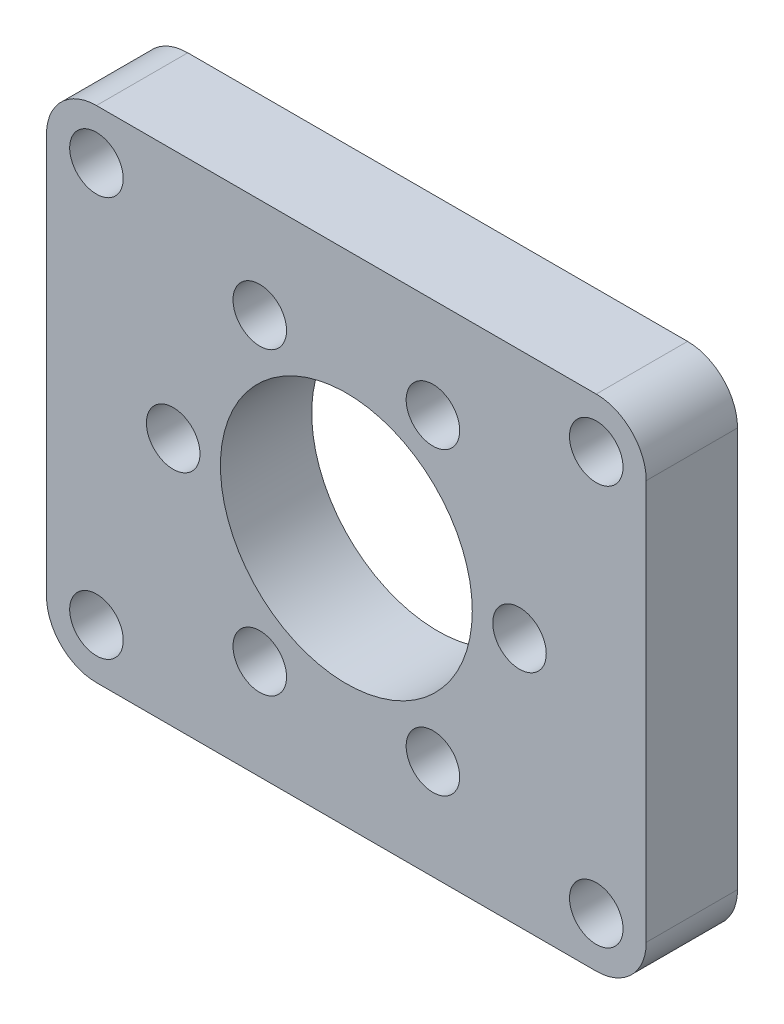
ISO-10303-21;
HEADER;
FILE_DESCRIPTION(('STEP AP214'),'2;1');
FILE_NAME('part.step','',(''),(''),'','','');
FILE_SCHEMA(('AUTOMOTIVE_DESIGN { 1 0 10303 214 1 1 1 1 }'));
ENDSEC;
DATA;
#1=APPLICATION_CONTEXT('core data for automotive mechanical design processes');
#2=APPLICATION_PROTOCOL_DEFINITION('international standard','automotive_design',2000,#1);
#3=PRODUCT_CONTEXT('',#1,'mechanical');
#4=PRODUCT('Part','Part','',(#3));
#5=PRODUCT_RELATED_PRODUCT_CATEGORY('part','',(#4));
#6=PRODUCT_DEFINITION_FORMATION('','',#4);
#7=PRODUCT_DEFINITION_CONTEXT('part definition',#1,'design');
#8=PRODUCT_DEFINITION('design','',#6,#7);
#9=PRODUCT_DEFINITION_SHAPE('','',#8);
#10=(LENGTH_UNIT() NAMED_UNIT(*) SI_UNIT(.MILLI.,.METRE.));
#11=(NAMED_UNIT(*) PLANE_ANGLE_UNIT() SI_UNIT($,.RADIAN.));
#12=(NAMED_UNIT(*) SI_UNIT($,.STERADIAN.) SOLID_ANGLE_UNIT());
#13=UNCERTAINTY_MEASURE_WITH_UNIT(LENGTH_MEASURE(1.E-05),#10,'distance_accuracy_value','');
#14=(GEOMETRIC_REPRESENTATION_CONTEXT(3) GLOBAL_UNCERTAINTY_ASSIGNED_CONTEXT((#13)) GLOBAL_UNIT_ASSIGNED_CONTEXT((#10,
#11,#12)) REPRESENTATION_CONTEXT('',''));
#15=CARTESIAN_POINT('',(0.,0.,0.));
#16=DIRECTION('',(0.,0.,1.));
#17=DIRECTION('',(1.,0.,0.));
#18=AXIS2_PLACEMENT_3D('',#15,#16,#17);
#19=CARTESIAN_POINT('',(0.,0.,5.8));
#20=DIRECTION('',(1.,0.,0.));
#21=DIRECTION('',(0.,0.,-1.));
#22=AXIS2_PLACEMENT_3D('',#19,#20,#21);
#23=PLANE('',#22);
#24=DIRECTION('',(0.,-1.,0.));
#25=VECTOR('',#24,1.);
#26=CARTESIAN_POINT('',(0.,0.,0.));
#27=LINE('',#26,#25);
#28=CARTESIAN_POINT('',(0.,28.575,0.));
#29=VERTEX_POINT('',#28);
#30=CARTESIAN_POINT('',(0.,3.175,0.));
#31=VERTEX_POINT('',#30);
#32=EDGE_CURVE('E128',#29,#31,#27,.T.);
#33=ORIENTED_EDGE('',*,*,#32,.T.);
#34=DIRECTION('',(0.,0.,-1.));
#35=VECTOR('',#34,1.);
#36=CARTESIAN_POINT('',(0.,3.175,5.8));
#37=LINE('',#36,#35);
#38=CARTESIAN_POINT('',(0.,3.175,5.8));
#39=VERTEX_POINT('',#38);
#40=EDGE_CURVE('E106',#31,#39,#37,.F.);
#41=ORIENTED_EDGE('',*,*,#40,.T.);
#42=DIRECTION('',(0.,-1.,0.));
#43=VECTOR('',#42,1.);
#44=CARTESIAN_POINT('',(0.,0.,5.8));
#45=LINE('',#44,#43);
#46=CARTESIAN_POINT('',(0.,28.575,5.8));
#47=VERTEX_POINT('',#46);
#48=EDGE_CURVE('E138',#47,#39,#45,.T.);
#49=ORIENTED_EDGE('',*,*,#48,.F.);
#50=DIRECTION('',(0.,0.,-1.));
#51=VECTOR('',#50,1.);
#52=CARTESIAN_POINT('',(0.,28.575,5.8));
#53=LINE('',#52,#51);
#54=EDGE_CURVE('E111',#47,#29,#53,.T.);
#55=ORIENTED_EDGE('',*,*,#54,.T.);
#56=EDGE_LOOP('',(#33,#41,#49,#55));
#57=FACE_BOUND('',#56,.T.);
#58=ADVANCED_FACE('F35',(#57),#23,.F.);
#59=CARTESIAN_POINT('',(0.,0.,5.8));
#60=DIRECTION('',(0.,1.,0.));
#61=DIRECTION('',(0.,0.,1.));
#62=AXIS2_PLACEMENT_3D('',#59,#60,#61);
#63=PLANE('',#62);
#64=DIRECTION('',(1.,0.,0.));
#65=VECTOR('',#64,1.);
#66=CARTESIAN_POINT('',(0.,0.,5.8));
#67=LINE('',#66,#65);
#68=CARTESIAN_POINT('',(3.175,0.,5.8));
#69=VERTEX_POINT('',#68);
#70=CARTESIAN_POINT('',(34.925,0.,5.8));
#71=VERTEX_POINT('',#70);
#72=EDGE_CURVE('E121',#69,#71,#67,.T.);
#73=ORIENTED_EDGE('',*,*,#72,.F.);
#74=DIRECTION('',(0.,0.,-1.));
#75=VECTOR('',#74,1.);
#76=CARTESIAN_POINT('',(3.175,0.,5.8));
#77=LINE('',#76,#75);
#78=CARTESIAN_POINT('',(3.175,0.,0.));
#79=VERTEX_POINT('',#78);
#80=EDGE_CURVE('E105',#69,#79,#77,.T.);
#81=ORIENTED_EDGE('',*,*,#80,.T.);
#82=DIRECTION('',(1.,0.,0.));
#83=VECTOR('',#82,1.);
#84=CARTESIAN_POINT('',(0.,0.,0.));
#85=LINE('',#84,#83);
#86=CARTESIAN_POINT('',(34.925,0.,0.));
#87=VERTEX_POINT('',#86);
#88=EDGE_CURVE('E118',#79,#87,#85,.T.);
#89=ORIENTED_EDGE('',*,*,#88,.T.);
#90=DIRECTION('',(0.,0.,-1.));
#91=VECTOR('',#90,1.);
#92=CARTESIAN_POINT('',(34.925,0.,5.8));
#93=LINE('',#92,#91);
#94=EDGE_CURVE('E123',#87,#71,#93,.F.);
#95=ORIENTED_EDGE('',*,*,#94,.T.);
#96=EDGE_LOOP('',(#73,#81,#89,#95));
#97=FACE_BOUND('',#96,.T.);
#98=ADVANCED_FACE('F117',(#97),#63,.F.);
#99=CARTESIAN_POINT('',(38.1,0.,5.8));
#100=DIRECTION('',(-1.,0.,0.));
#101=DIRECTION('',(0.,0.,1.));
#102=AXIS2_PLACEMENT_3D('',#99,#100,#101);
#103=PLANE('',#102);
#104=DIRECTION('',(0.,1.,0.));
#105=VECTOR('',#104,1.);
#106=CARTESIAN_POINT('',(38.1,0.,0.));
#107=LINE('',#106,#105);
#108=CARTESIAN_POINT('',(38.1,3.175,0.));
#109=VERTEX_POINT('',#108);
#110=CARTESIAN_POINT('',(38.1,28.575,0.));
#111=VERTEX_POINT('',#110);
#112=EDGE_CURVE('E127',#109,#111,#107,.T.);
#113=ORIENTED_EDGE('',*,*,#112,.T.);
#114=DIRECTION('',(0.,0.,-1.));
#115=VECTOR('',#114,1.);
#116=CARTESIAN_POINT('',(38.1,28.575,5.8));
#117=LINE('',#116,#115);
#118=CARTESIAN_POINT('',(38.1,28.575,5.8));
#119=VERTEX_POINT('',#118);
#120=EDGE_CURVE('E11',#111,#119,#117,.F.);
#121=ORIENTED_EDGE('',*,*,#120,.T.);
#122=DIRECTION('',(0.,1.,0.));
#123=VECTOR('',#122,1.);
#124=CARTESIAN_POINT('',(38.1,0.,5.8));
#125=LINE('',#124,#123);
#126=CARTESIAN_POINT('',(38.1,3.175,5.8));
#127=VERTEX_POINT('',#126);
#128=EDGE_CURVE('E169',#127,#119,#125,.T.);
#129=ORIENTED_EDGE('',*,*,#128,.F.);
#130=DIRECTION('',(0.,0.,-1.));
#131=VECTOR('',#130,1.);
#132=CARTESIAN_POINT('',(38.1,3.175,5.8));
#133=LINE('',#132,#131);
#134=EDGE_CURVE('E43',#127,#109,#133,.T.);
#135=ORIENTED_EDGE('',*,*,#134,.T.);
#136=EDGE_LOOP('',(#113,#121,#129,#135));
#137=FACE_BOUND('',#136,.T.);
#138=ADVANCED_FACE('F167',(#137),#103,.F.);
#139=CARTESIAN_POINT('',(0.,31.75,5.8));
#140=DIRECTION('',(0.,-1.,0.));
#141=DIRECTION('',(0.,0.,-1.));
#142=AXIS2_PLACEMENT_3D('',#139,#140,#141);
#143=PLANE('',#142);
#144=DIRECTION('',(-1.,0.,0.));
#145=VECTOR('',#144,1.);
#146=CARTESIAN_POINT('',(0.,31.75,0.));
#147=LINE('',#146,#145);
#148=CARTESIAN_POINT('',(34.925,31.75,0.));
#149=VERTEX_POINT('',#148);
#150=CARTESIAN_POINT('',(3.175,31.75,0.));
#151=VERTEX_POINT('',#150);
#152=EDGE_CURVE('E131',#149,#151,#147,.T.);
#153=ORIENTED_EDGE('',*,*,#152,.T.);
#154=DIRECTION('',(0.,0.,-1.));
#155=VECTOR('',#154,1.);
#156=CARTESIAN_POINT('',(3.175,31.75,5.8));
#157=LINE('',#156,#155);
#158=CARTESIAN_POINT('',(3.175,31.75,5.8));
#159=VERTEX_POINT('',#158);
#160=EDGE_CURVE('E50',#151,#159,#157,.F.);
#161=ORIENTED_EDGE('',*,*,#160,.T.);
#162=DIRECTION('',(-1.,0.,0.));
#163=VECTOR('',#162,1.);
#164=CARTESIAN_POINT('',(0.,31.75,5.8));
#165=LINE('',#164,#163);
#166=CARTESIAN_POINT('',(34.925,31.75,5.8));
#167=VERTEX_POINT('',#166);
#168=EDGE_CURVE('E144',#167,#159,#165,.T.);
#169=ORIENTED_EDGE('',*,*,#168,.F.);
#170=DIRECTION('',(0.,0.,-1.));
#171=VECTOR('',#170,1.);
#172=CARTESIAN_POINT('',(34.925,31.75,5.8));
#173=LINE('',#172,#171);
#174=EDGE_CURVE('E160',#167,#149,#173,.T.);
#175=ORIENTED_EDGE('',*,*,#174,.T.);
#176=EDGE_LOOP('',(#153,#161,#169,#175));
#177=FACE_BOUND('',#176,.T.);
#178=ADVANCED_FACE('F176',(#177),#143,.F.);
#179=CARTESIAN_POINT('',(0.,31.75,5.8));
#180=DIRECTION('',(0.,0.,-1.));
#181=DIRECTION('',(-1.,0.,0.));
#182=AXIS2_PLACEMENT_3D('',#179,#180,#181);
#183=PLANE('',#182);
#184=CARTESIAN_POINT('',(3.175,28.575,5.8));
#185=DIRECTION('',(0.,0.,1.));
#186=DIRECTION('',(1.,0.,0.));
#187=AXIS2_PLACEMENT_3D('',#184,#185,#186);
#188=CIRCLE('',#187,1.69999999999999);
#189=CARTESIAN_POINT('',(4.87499999999999,28.575,5.8));
#190=VERTEX_POINT('',#189);
#191=EDGE_CURVE('E240',#190,#190,#188,.T.);
#192=ORIENTED_EDGE('',*,*,#191,.F.);
#193=EDGE_LOOP('',(#192));
#194=FACE_BOUND('',#193,.T.);
#195=CARTESIAN_POINT('',(34.925,28.575,5.8));
#196=DIRECTION('',(0.,0.,1.));
#197=DIRECTION('',(1.,0.,0.));
#198=AXIS2_PLACEMENT_3D('',#195,#196,#197);
#199=CIRCLE('',#198,1.69999999999999);
#200=CARTESIAN_POINT('',(36.625,28.575,5.8));
#201=VERTEX_POINT('',#200);
#202=EDGE_CURVE('E234',#201,#201,#199,.T.);
#203=ORIENTED_EDGE('',*,*,#202,.F.);
#204=EDGE_LOOP('',(#203));
#205=FACE_BOUND('',#204,.T.);
#206=CARTESIAN_POINT('',(34.925,3.175,5.8));
#207=DIRECTION('',(0.,0.,1.));
#208=DIRECTION('',(1.,0.,0.));
#209=AXIS2_PLACEMENT_3D('',#206,#207,#208);
#210=CIRCLE('',#209,1.69999999999999);
#211=CARTESIAN_POINT('',(36.625,3.175,5.8));
#212=VERTEX_POINT('',#211);
#213=EDGE_CURVE('E228',#212,#212,#210,.T.);
#214=ORIENTED_EDGE('',*,*,#213,.F.);
#215=EDGE_LOOP('',(#214));
#216=FACE_BOUND('',#215,.T.);
#217=CARTESIAN_POINT('',(3.175,3.17500000000001,5.8));
#218=DIRECTION('',(0.,0.,1.));
#219=DIRECTION('',(1.,0.,0.));
#220=AXIS2_PLACEMENT_3D('',#217,#218,#219);
#221=CIRCLE('',#220,1.69999999999999);
#222=CARTESIAN_POINT('',(4.87499999999999,3.17500000000001,5.8));
#223=VERTEX_POINT('',#222);
#224=EDGE_CURVE('E222',#223,#223,#221,.T.);
#225=ORIENTED_EDGE('',*,*,#224,.F.);
#226=EDGE_LOOP('',(#225));
#227=FACE_BOUND('',#226,.T.);
#228=CARTESIAN_POINT('',(30.05,15.875,5.8));
#229=DIRECTION('',(0.,0.,1.));
#230=DIRECTION('',(1.,0.,0.));
#231=AXIS2_PLACEMENT_3D('',#228,#229,#230);
#232=CIRCLE('',#231,1.69999999999999);
#233=CARTESIAN_POINT('',(31.75,15.875,5.8));
#234=VERTEX_POINT('',#233);
#235=EDGE_CURVE('E216',#234,#234,#232,.T.);
#236=ORIENTED_EDGE('',*,*,#235,.F.);
#237=EDGE_LOOP('',(#236));
#238=FACE_BOUND('',#237,.T.);
#239=CARTESIAN_POINT('',(24.55,25.4012794416288,5.8));
#240=DIRECTION('',(0.,0.,1.));
#241=DIRECTION('',(1.,0.,0.));
#242=AXIS2_PLACEMENT_3D('',#239,#240,#241);
#243=CIRCLE('',#242,1.69999999999999);
#244=CARTESIAN_POINT('',(26.25,25.4012794416288,5.8));
#245=VERTEX_POINT('',#244);
#246=EDGE_CURVE('E210',#245,#245,#243,.T.);
#247=ORIENTED_EDGE('',*,*,#246,.F.);
#248=EDGE_LOOP('',(#247));
#249=FACE_BOUND('',#248,.T.);
#250=CARTESIAN_POINT('',(13.55,25.4012794416288,5.8));
#251=DIRECTION('',(0.,0.,1.));
#252=DIRECTION('',(1.,0.,0.));
#253=AXIS2_PLACEMENT_3D('',#250,#251,#252);
#254=CIRCLE('',#253,1.69999999999999);
#255=CARTESIAN_POINT('',(15.25,25.4012794416288,5.8));
#256=VERTEX_POINT('',#255);
#257=EDGE_CURVE('E143',#256,#256,#254,.T.);
#258=ORIENTED_EDGE('',*,*,#257,.F.);
#259=EDGE_LOOP('',(#258));
#260=FACE_BOUND('',#259,.T.);
#261=CARTESIAN_POINT('',(8.05,15.875,5.8));
#262=DIRECTION('',(0.,0.,1.));
#263=DIRECTION('',(1.,0.,0.));
#264=AXIS2_PLACEMENT_3D('',#261,#262,#263);
#265=CIRCLE('',#264,1.69999999999999);
#266=CARTESIAN_POINT('',(9.74999999999999,15.875,5.8));
#267=VERTEX_POINT('',#266);
#268=EDGE_CURVE('E142',#267,#267,#265,.T.);
#269=ORIENTED_EDGE('',*,*,#268,.F.);
#270=EDGE_LOOP('',(#269));
#271=FACE_BOUND('',#270,.T.);
#272=CARTESIAN_POINT('',(13.55,6.34872055837117,5.8));
#273=DIRECTION('',(0.,0.,1.));
#274=DIRECTION('',(1.,0.,0.));
#275=AXIS2_PLACEMENT_3D('',#272,#273,#274);
#276=CIRCLE('',#275,1.69999999999999);
#277=CARTESIAN_POINT('',(15.25,6.34872055837117,5.8));
#278=VERTEX_POINT('',#277);
#279=EDGE_CURVE('E197',#278,#278,#276,.T.);
#280=ORIENTED_EDGE('',*,*,#279,.F.);
#281=EDGE_LOOP('',(#280));
#282=FACE_BOUND('',#281,.T.);
#283=CARTESIAN_POINT('',(24.55,6.34872055837118,5.8));
#284=DIRECTION('',(0.,0.,1.));
#285=DIRECTION('',(1.,0.,0.));
#286=AXIS2_PLACEMENT_3D('',#283,#284,#285);
#287=CIRCLE('',#286,1.69999999999999);
#288=CARTESIAN_POINT('',(26.25,6.34872055837118,5.8));
#289=VERTEX_POINT('',#288);
#290=EDGE_CURVE('E191',#289,#289,#287,.T.);
#291=ORIENTED_EDGE('',*,*,#290,.F.);
#292=EDGE_LOOP('',(#291));
#293=FACE_BOUND('',#292,.T.);
#294=CARTESIAN_POINT('',(19.05,15.875,5.8));
#295=DIRECTION('',(0.,0.,1.));
#296=DIRECTION('',(1.,0.,0.));
#297=AXIS2_PLACEMENT_3D('',#294,#295,#296);
#298=CIRCLE('',#297,8.);
#299=CARTESIAN_POINT('',(27.05,15.875,5.8));
#300=VERTEX_POINT('',#299);
#301=EDGE_CURVE('E183',#300,#300,#298,.T.);
#302=ORIENTED_EDGE('',*,*,#301,.F.);
#303=EDGE_LOOP('',(#302));
#304=FACE_BOUND('',#303,.T.);
#305=ORIENTED_EDGE('',*,*,#48,.T.);
#306=CARTESIAN_POINT('',(3.175,3.175,5.8));
#307=DIRECTION('',(0.,0.,-1.));
#308=DIRECTION('',(-1.,0.,0.));
#309=AXIS2_PLACEMENT_3D('',#306,#307,#308);
#310=CIRCLE('',#309,3.175);
#311=EDGE_CURVE('E158',#39,#69,#310,.F.);
#312=ORIENTED_EDGE('',*,*,#311,.T.);
#313=ORIENTED_EDGE('',*,*,#72,.T.);
#314=CARTESIAN_POINT('',(34.925,3.175,5.8));
#315=DIRECTION('',(0.,0.,-1.));
#316=DIRECTION('',(-1.,0.,0.));
#317=AXIS2_PLACEMENT_3D('',#314,#315,#316);
#318=CIRCLE('',#317,3.175);
#319=EDGE_CURVE('E153',#71,#127,#318,.F.);
#320=ORIENTED_EDGE('',*,*,#319,.T.);
#321=ORIENTED_EDGE('',*,*,#128,.T.);
#322=CARTESIAN_POINT('',(34.925,28.575,5.8));
#323=DIRECTION('',(0.,0.,-1.));
#324=DIRECTION('',(-1.,0.,0.));
#325=AXIS2_PLACEMENT_3D('',#322,#323,#324);
#326=CIRCLE('',#325,3.175);
#327=EDGE_CURVE('E57',#119,#167,#326,.F.);
#328=ORIENTED_EDGE('',*,*,#327,.T.);
#329=ORIENTED_EDGE('',*,*,#168,.T.);
#330=CARTESIAN_POINT('',(3.175,28.575,5.8));
#331=DIRECTION('',(0.,0.,-1.));
#332=DIRECTION('',(-1.,0.,0.));
#333=AXIS2_PLACEMENT_3D('',#330,#331,#332);
#334=CIRCLE('',#333,3.175);
#335=EDGE_CURVE('E156',#159,#47,#334,.F.);
#336=ORIENTED_EDGE('',*,*,#335,.T.);
#337=EDGE_LOOP('',(#305,#312,#313,#320,#321,#328,#329,#336));
#338=FACE_BOUND('',#337,.T.);
#339=ADVANCED_FACE('F246',(#194,#205,#216,#227,#238,#249,#260,#271,#282,#293,#304,#338),#183,.F.);
#340=CARTESIAN_POINT('',(0.,31.75,0.));
#341=DIRECTION('',(0.,0.,-1.));
#342=DIRECTION('',(-1.,0.,0.));
#343=AXIS2_PLACEMENT_3D('',#340,#341,#342);
#344=PLANE('',#343);
#345=CARTESIAN_POINT('',(3.175,28.575,0.));
#346=DIRECTION('',(0.,0.,-1.));
#347=DIRECTION('',(-1.,0.,0.));
#348=AXIS2_PLACEMENT_3D('',#345,#346,#347);
#349=CIRCLE('',#348,1.69999999999999);
#350=CARTESIAN_POINT('',(1.47500000000001,28.575,0.));
#351=VERTEX_POINT('',#350);
#352=EDGE_CURVE('E237',#351,#351,#349,.T.);
#353=ORIENTED_EDGE('',*,*,#352,.F.);
#354=EDGE_LOOP('',(#353));
#355=FACE_BOUND('',#354,.T.);
#356=CARTESIAN_POINT('',(34.925,28.575,0.));
#357=DIRECTION('',(0.,0.,-1.));
#358=DIRECTION('',(-1.,0.,0.));
#359=AXIS2_PLACEMENT_3D('',#356,#357,#358);
#360=CIRCLE('',#359,1.69999999999999);
#361=CARTESIAN_POINT('',(33.225,28.575,0.));
#362=VERTEX_POINT('',#361);
#363=EDGE_CURVE('E231',#362,#362,#360,.T.);
#364=ORIENTED_EDGE('',*,*,#363,.F.);
#365=EDGE_LOOP('',(#364));
#366=FACE_BOUND('',#365,.T.);
#367=CARTESIAN_POINT('',(34.925,3.175,0.));
#368=DIRECTION('',(0.,0.,-1.));
#369=DIRECTION('',(-1.,0.,0.));
#370=AXIS2_PLACEMENT_3D('',#367,#368,#369);
#371=CIRCLE('',#370,1.69999999999999);
#372=CARTESIAN_POINT('',(33.225,3.175,0.));
#373=VERTEX_POINT('',#372);
#374=EDGE_CURVE('E225',#373,#373,#371,.T.);
#375=ORIENTED_EDGE('',*,*,#374,.F.);
#376=EDGE_LOOP('',(#375));
#377=FACE_BOUND('',#376,.T.);
#378=CARTESIAN_POINT('',(3.175,3.17500000000001,0.));
#379=DIRECTION('',(0.,0.,-1.));
#380=DIRECTION('',(-1.,0.,0.));
#381=AXIS2_PLACEMENT_3D('',#378,#379,#380);
#382=CIRCLE('',#381,1.69999999999999);
#383=CARTESIAN_POINT('',(1.47500000000001,3.17500000000001,0.));
#384=VERTEX_POINT('',#383);
#385=EDGE_CURVE('E219',#384,#384,#382,.T.);
#386=ORIENTED_EDGE('',*,*,#385,.F.);
#387=EDGE_LOOP('',(#386));
#388=FACE_BOUND('',#387,.T.);
#389=CARTESIAN_POINT('',(30.05,15.875,0.));
#390=DIRECTION('',(0.,0.,-1.));
#391=DIRECTION('',(-1.,0.,0.));
#392=AXIS2_PLACEMENT_3D('',#389,#390,#391);
#393=CIRCLE('',#392,1.69999999999999);
#394=CARTESIAN_POINT('',(28.35,15.875,0.));
#395=VERTEX_POINT('',#394);
#396=EDGE_CURVE('E213',#395,#395,#393,.T.);
#397=ORIENTED_EDGE('',*,*,#396,.F.);
#398=EDGE_LOOP('',(#397));
#399=FACE_BOUND('',#398,.T.);
#400=CARTESIAN_POINT('',(24.55,25.4012794416288,0.));
#401=DIRECTION('',(0.,0.,-1.));
#402=DIRECTION('',(-1.,0.,0.));
#403=AXIS2_PLACEMENT_3D('',#400,#401,#402);
#404=CIRCLE('',#403,1.69999999999999);
#405=CARTESIAN_POINT('',(22.85,25.4012794416288,0.));
#406=VERTEX_POINT('',#405);
#407=EDGE_CURVE('E207',#406,#406,#404,.T.);
#408=ORIENTED_EDGE('',*,*,#407,.F.);
#409=EDGE_LOOP('',(#408));
#410=FACE_BOUND('',#409,.T.);
#411=CARTESIAN_POINT('',(13.55,25.4012794416288,0.));
#412=DIRECTION('',(0.,0.,-1.));
#413=DIRECTION('',(-1.,0.,0.));
#414=AXIS2_PLACEMENT_3D('',#411,#412,#413);
#415=CIRCLE('',#414,1.69999999999999);
#416=CARTESIAN_POINT('',(11.85,25.4012794416288,0.));
#417=VERTEX_POINT('',#416);
#418=EDGE_CURVE('E139',#417,#417,#415,.T.);
#419=ORIENTED_EDGE('',*,*,#418,.F.);
#420=EDGE_LOOP('',(#419));
#421=FACE_BOUND('',#420,.T.);
#422=CARTESIAN_POINT('',(8.05,15.875,0.));
#423=DIRECTION('',(0.,0.,-1.));
#424=DIRECTION('',(-1.,0.,0.));
#425=AXIS2_PLACEMENT_3D('',#422,#423,#424);
#426=CIRCLE('',#425,1.69999999999999);
#427=CARTESIAN_POINT('',(6.35000000000001,15.875,0.));
#428=VERTEX_POINT('',#427);
#429=EDGE_CURVE('E200',#428,#428,#426,.T.);
#430=ORIENTED_EDGE('',*,*,#429,.F.);
#431=EDGE_LOOP('',(#430));
#432=FACE_BOUND('',#431,.T.);
#433=CARTESIAN_POINT('',(13.55,6.34872055837117,0.));
#434=DIRECTION('',(0.,0.,-1.));
#435=DIRECTION('',(-1.,0.,0.));
#436=AXIS2_PLACEMENT_3D('',#433,#434,#435);
#437=CIRCLE('',#436,1.69999999999999);
#438=CARTESIAN_POINT('',(11.85,6.34872055837117,0.));
#439=VERTEX_POINT('',#438);
#440=EDGE_CURVE('E194',#439,#439,#437,.T.);
#441=ORIENTED_EDGE('',*,*,#440,.F.);
#442=EDGE_LOOP('',(#441));
#443=FACE_BOUND('',#442,.T.);
#444=CARTESIAN_POINT('',(24.55,6.34872055837118,0.));
#445=DIRECTION('',(0.,0.,-1.));
#446=DIRECTION('',(-1.,0.,0.));
#447=AXIS2_PLACEMENT_3D('',#444,#445,#446);
#448=CIRCLE('',#447,1.69999999999999);
#449=CARTESIAN_POINT('',(22.85,6.34872055837118,0.));
#450=VERTEX_POINT('',#449);
#451=EDGE_CURVE('E186',#450,#450,#448,.T.);
#452=ORIENTED_EDGE('',*,*,#451,.F.);
#453=EDGE_LOOP('',(#452));
#454=FACE_BOUND('',#453,.T.);
#455=CARTESIAN_POINT('',(19.05,15.875,0.));
#456=DIRECTION('',(0.,0.,1.));
#457=DIRECTION('',(1.,0.,0.));
#458=AXIS2_PLACEMENT_3D('',#455,#456,#457);
#459=CIRCLE('',#458,8.);
#460=CARTESIAN_POINT('',(27.05,15.875,0.));
#461=VERTEX_POINT('',#460);
#462=EDGE_CURVE('E133',#461,#461,#459,.T.);
#463=ORIENTED_EDGE('',*,*,#462,.T.);
#464=EDGE_LOOP('',(#463));
#465=FACE_BOUND('',#464,.T.);
#466=ORIENTED_EDGE('',*,*,#88,.F.);
#467=CARTESIAN_POINT('',(3.175,3.175,0.));
#468=DIRECTION('',(0.,0.,-1.));
#469=DIRECTION('',(-1.,0.,0.));
#470=AXIS2_PLACEMENT_3D('',#467,#468,#469);
#471=CIRCLE('',#470,3.175);
#472=EDGE_CURVE('E101',#79,#31,#471,.T.);
#473=ORIENTED_EDGE('',*,*,#472,.T.);
#474=ORIENTED_EDGE('',*,*,#32,.F.);
#475=CARTESIAN_POINT('',(3.175,28.575,0.));
#476=DIRECTION('',(0.,0.,-1.));
#477=DIRECTION('',(-1.,0.,0.));
#478=AXIS2_PLACEMENT_3D('',#475,#476,#477);
#479=CIRCLE('',#478,3.175);
#480=EDGE_CURVE('E112',#29,#151,#479,.T.);
#481=ORIENTED_EDGE('',*,*,#480,.T.);
#482=ORIENTED_EDGE('',*,*,#152,.F.);
#483=CARTESIAN_POINT('',(34.925,28.575,0.));
#484=DIRECTION('',(0.,0.,-1.));
#485=DIRECTION('',(-1.,0.,0.));
#486=AXIS2_PLACEMENT_3D('',#483,#484,#485);
#487=CIRCLE('',#486,3.175);
#488=EDGE_CURVE('E147',#149,#111,#487,.T.);
#489=ORIENTED_EDGE('',*,*,#488,.T.);
#490=ORIENTED_EDGE('',*,*,#112,.F.);
#491=CARTESIAN_POINT('',(34.925,3.175,0.));
#492=DIRECTION('',(0.,0.,-1.));
#493=DIRECTION('',(-1.,0.,0.));
#494=AXIS2_PLACEMENT_3D('',#491,#492,#493);
#495=CIRCLE('',#494,3.175);
#496=EDGE_CURVE('E122',#109,#87,#495,.T.);
#497=ORIENTED_EDGE('',*,*,#496,.T.);
#498=EDGE_LOOP('',(#466,#473,#474,#481,#482,#489,#490,#497));
#499=FACE_BOUND('',#498,.T.);
#500=ADVANCED_FACE('F125',(#355,#366,#377,#388,#399,#410,#421,#432,#443,#454,#465,#499),#344,.T.);
#501=CARTESIAN_POINT('',(19.05,15.875,0.));
#502=DIRECTION('',(0.,0.,1.));
#503=DIRECTION('',(1.,0.,0.));
#504=AXIS2_PLACEMENT_3D('',#501,#502,#503);
#505=CYLINDRICAL_SURFACE('',#504,8.);
#506=ORIENTED_EDGE('',*,*,#462,.F.);
#507=EDGE_LOOP('',(#506));
#508=FACE_BOUND('',#507,.T.);
#509=ORIENTED_EDGE('',*,*,#301,.T.);
#510=EDGE_LOOP('',(#509));
#511=FACE_BOUND('',#510,.T.);
#512=ADVANCED_FACE('F293',(#508,#511),#505,.F.);
#513=CARTESIAN_POINT('',(24.55,6.34872055837118,5.8));
#514=DIRECTION('',(0.,0.,1.));
#515=DIRECTION('',(1.,0.,0.));
#516=AXIS2_PLACEMENT_3D('',#513,#514,#515);
#517=CYLINDRICAL_SURFACE('',#516,1.69999999999999);
#518=ORIENTED_EDGE('',*,*,#451,.T.);
#519=EDGE_LOOP('',(#518));
#520=FACE_BOUND('',#519,.T.);
#521=ORIENTED_EDGE('',*,*,#290,.T.);
#522=EDGE_LOOP('',(#521));
#523=FACE_BOUND('',#522,.T.);
#524=ADVANCED_FACE('F298',(#520,#523),#517,.F.);
#525=CARTESIAN_POINT('',(13.55,6.34872055837117,5.8));
#526=DIRECTION('',(0.,0.,1.));
#527=DIRECTION('',(1.,0.,0.));
#528=AXIS2_PLACEMENT_3D('',#525,#526,#527);
#529=CYLINDRICAL_SURFACE('',#528,1.69999999999999);
#530=ORIENTED_EDGE('',*,*,#440,.T.);
#531=EDGE_LOOP('',(#530));
#532=FACE_BOUND('',#531,.T.);
#533=ORIENTED_EDGE('',*,*,#279,.T.);
#534=EDGE_LOOP('',(#533));
#535=FACE_BOUND('',#534,.T.);
#536=ADVANCED_FACE('F302',(#532,#535),#529,.F.);
#537=CARTESIAN_POINT('',(8.05,15.875,5.8));
#538=DIRECTION('',(0.,0.,1.));
#539=DIRECTION('',(1.,0.,0.));
#540=AXIS2_PLACEMENT_3D('',#537,#538,#539);
#541=CYLINDRICAL_SURFACE('',#540,1.69999999999999);
#542=ORIENTED_EDGE('',*,*,#429,.T.);
#543=EDGE_LOOP('',(#542));
#544=FACE_BOUND('',#543,.T.);
#545=ORIENTED_EDGE('',*,*,#268,.T.);
#546=EDGE_LOOP('',(#545));
#547=FACE_BOUND('',#546,.T.);
#548=ADVANCED_FACE('F306',(#544,#547),#541,.F.);
#549=CARTESIAN_POINT('',(13.55,25.4012794416288,5.8));
#550=DIRECTION('',(0.,0.,1.));
#551=DIRECTION('',(1.,0.,0.));
#552=AXIS2_PLACEMENT_3D('',#549,#550,#551);
#553=CYLINDRICAL_SURFACE('',#552,1.69999999999999);
#554=ORIENTED_EDGE('',*,*,#418,.T.);
#555=EDGE_LOOP('',(#554));
#556=FACE_BOUND('',#555,.T.);
#557=ORIENTED_EDGE('',*,*,#257,.T.);
#558=EDGE_LOOP('',(#557));
#559=FACE_BOUND('',#558,.T.);
#560=ADVANCED_FACE('F310',(#556,#559),#553,.F.);
#561=CARTESIAN_POINT('',(24.55,25.4012794416288,5.8));
#562=DIRECTION('',(0.,0.,1.));
#563=DIRECTION('',(1.,0.,0.));
#564=AXIS2_PLACEMENT_3D('',#561,#562,#563);
#565=CYLINDRICAL_SURFACE('',#564,1.69999999999999);
#566=ORIENTED_EDGE('',*,*,#407,.T.);
#567=EDGE_LOOP('',(#566));
#568=FACE_BOUND('',#567,.T.);
#569=ORIENTED_EDGE('',*,*,#246,.T.);
#570=EDGE_LOOP('',(#569));
#571=FACE_BOUND('',#570,.T.);
#572=ADVANCED_FACE('F314',(#568,#571),#565,.F.);
#573=CARTESIAN_POINT('',(30.05,15.875,5.8));
#574=DIRECTION('',(0.,0.,1.));
#575=DIRECTION('',(1.,0.,0.));
#576=AXIS2_PLACEMENT_3D('',#573,#574,#575);
#577=CYLINDRICAL_SURFACE('',#576,1.69999999999999);
#578=ORIENTED_EDGE('',*,*,#396,.T.);
#579=EDGE_LOOP('',(#578));
#580=FACE_BOUND('',#579,.T.);
#581=ORIENTED_EDGE('',*,*,#235,.T.);
#582=EDGE_LOOP('',(#581));
#583=FACE_BOUND('',#582,.T.);
#584=ADVANCED_FACE('F318',(#580,#583),#577,.F.);
#585=CARTESIAN_POINT('',(3.175,3.17500000000001,5.8));
#586=DIRECTION('',(0.,0.,1.));
#587=DIRECTION('',(1.,0.,0.));
#588=AXIS2_PLACEMENT_3D('',#585,#586,#587);
#589=CYLINDRICAL_SURFACE('',#588,1.69999999999999);
#590=ORIENTED_EDGE('',*,*,#385,.T.);
#591=EDGE_LOOP('',(#590));
#592=FACE_BOUND('',#591,.T.);
#593=ORIENTED_EDGE('',*,*,#224,.T.);
#594=EDGE_LOOP('',(#593));
#595=FACE_BOUND('',#594,.T.);
#596=ADVANCED_FACE('F322',(#592,#595),#589,.F.);
#597=CARTESIAN_POINT('',(34.925,3.175,5.8));
#598=DIRECTION('',(0.,0.,1.));
#599=DIRECTION('',(1.,0.,0.));
#600=AXIS2_PLACEMENT_3D('',#597,#598,#599);
#601=CYLINDRICAL_SURFACE('',#600,1.69999999999999);
#602=ORIENTED_EDGE('',*,*,#374,.T.);
#603=EDGE_LOOP('',(#602));
#604=FACE_BOUND('',#603,.T.);
#605=ORIENTED_EDGE('',*,*,#213,.T.);
#606=EDGE_LOOP('',(#605));
#607=FACE_BOUND('',#606,.T.);
#608=ADVANCED_FACE('F326',(#604,#607),#601,.F.);
#609=CARTESIAN_POINT('',(34.925,28.575,5.8));
#610=DIRECTION('',(0.,0.,1.));
#611=DIRECTION('',(1.,0.,0.));
#612=AXIS2_PLACEMENT_3D('',#609,#610,#611);
#613=CYLINDRICAL_SURFACE('',#612,1.69999999999999);
#614=ORIENTED_EDGE('',*,*,#363,.T.);
#615=EDGE_LOOP('',(#614));
#616=FACE_BOUND('',#615,.T.);
#617=ORIENTED_EDGE('',*,*,#202,.T.);
#618=EDGE_LOOP('',(#617));
#619=FACE_BOUND('',#618,.T.);
#620=ADVANCED_FACE('F330',(#616,#619),#613,.F.);
#621=CARTESIAN_POINT('',(3.175,28.575,5.8));
#622=DIRECTION('',(0.,0.,1.));
#623=DIRECTION('',(1.,0.,0.));
#624=AXIS2_PLACEMENT_3D('',#621,#622,#623);
#625=CYLINDRICAL_SURFACE('',#624,1.69999999999999);
#626=ORIENTED_EDGE('',*,*,#352,.T.);
#627=EDGE_LOOP('',(#626));
#628=FACE_BOUND('',#627,.T.);
#629=ORIENTED_EDGE('',*,*,#191,.T.);
#630=EDGE_LOOP('',(#629));
#631=FACE_BOUND('',#630,.T.);
#632=ADVANCED_FACE('F244',(#628,#631),#625,.F.);
#633=CARTESIAN_POINT('',(3.175,3.175,5.8));
#634=DIRECTION('',(0.,0.,-1.));
#635=DIRECTION('',(-1.,0.,0.));
#636=AXIS2_PLACEMENT_3D('',#633,#634,#635);
#637=CYLINDRICAL_SURFACE('',#636,3.175);
#638=ORIENTED_EDGE('',*,*,#311,.F.);
#639=ORIENTED_EDGE('',*,*,#40,.F.);
#640=ORIENTED_EDGE('',*,*,#472,.F.);
#641=ORIENTED_EDGE('',*,*,#80,.F.);
#642=EDGE_LOOP('',(#638,#639,#640,#641));
#643=FACE_BOUND('',#642,.T.);
#644=ADVANCED_FACE('F104',(#643),#637,.T.);
#645=CARTESIAN_POINT('',(3.175,28.575,5.8));
#646=DIRECTION('',(0.,0.,-1.));
#647=DIRECTION('',(-1.,0.,0.));
#648=AXIS2_PLACEMENT_3D('',#645,#646,#647);
#649=CYLINDRICAL_SURFACE('',#648,3.175);
#650=ORIENTED_EDGE('',*,*,#335,.F.);
#651=ORIENTED_EDGE('',*,*,#160,.F.);
#652=ORIENTED_EDGE('',*,*,#480,.F.);
#653=ORIENTED_EDGE('',*,*,#54,.F.);
#654=EDGE_LOOP('',(#650,#651,#652,#653));
#655=FACE_BOUND('',#654,.T.);
#656=ADVANCED_FACE('F273',(#655),#649,.T.);
#657=CARTESIAN_POINT('',(34.925,28.575,5.8));
#658=DIRECTION('',(0.,0.,-1.));
#659=DIRECTION('',(-1.,0.,0.));
#660=AXIS2_PLACEMENT_3D('',#657,#658,#659);
#661=CYLINDRICAL_SURFACE('',#660,3.175);
#662=ORIENTED_EDGE('',*,*,#327,.F.);
#663=ORIENTED_EDGE('',*,*,#120,.F.);
#664=ORIENTED_EDGE('',*,*,#488,.F.);
#665=ORIENTED_EDGE('',*,*,#174,.F.);
#666=EDGE_LOOP('',(#662,#663,#664,#665));
#667=FACE_BOUND('',#666,.T.);
#668=ADVANCED_FACE('F175',(#667),#661,.T.);
#669=CARTESIAN_POINT('',(34.925,3.175,5.8));
#670=DIRECTION('',(0.,0.,-1.));
#671=DIRECTION('',(-1.,0.,0.));
#672=AXIS2_PLACEMENT_3D('',#669,#670,#671);
#673=CYLINDRICAL_SURFACE('',#672,3.175);
#674=ORIENTED_EDGE('',*,*,#319,.F.);
#675=ORIENTED_EDGE('',*,*,#94,.F.);
#676=ORIENTED_EDGE('',*,*,#496,.F.);
#677=ORIENTED_EDGE('',*,*,#134,.F.);
#678=EDGE_LOOP('',(#674,#675,#676,#677));
#679=FACE_BOUND('',#678,.T.);
#680=ADVANCED_FACE('F37',(#679),#673,.T.);
#681=CLOSED_SHELL('',(#58,#98,#138,#178,#339,#500,#512,#524,#536,#548,#560,#572,#584,#596,#608,
#620,#632,#644,#656,#668,#680));
#682=MANIFOLD_SOLID_BREP('B2',#681);
#683=ADVANCED_BREP_SHAPE_REPRESENTATION('',(#18,#682),#14);
#684=SHAPE_DEFINITION_REPRESENTATION(#9,#683);
ENDSEC;
END-ISO-10303-21;
